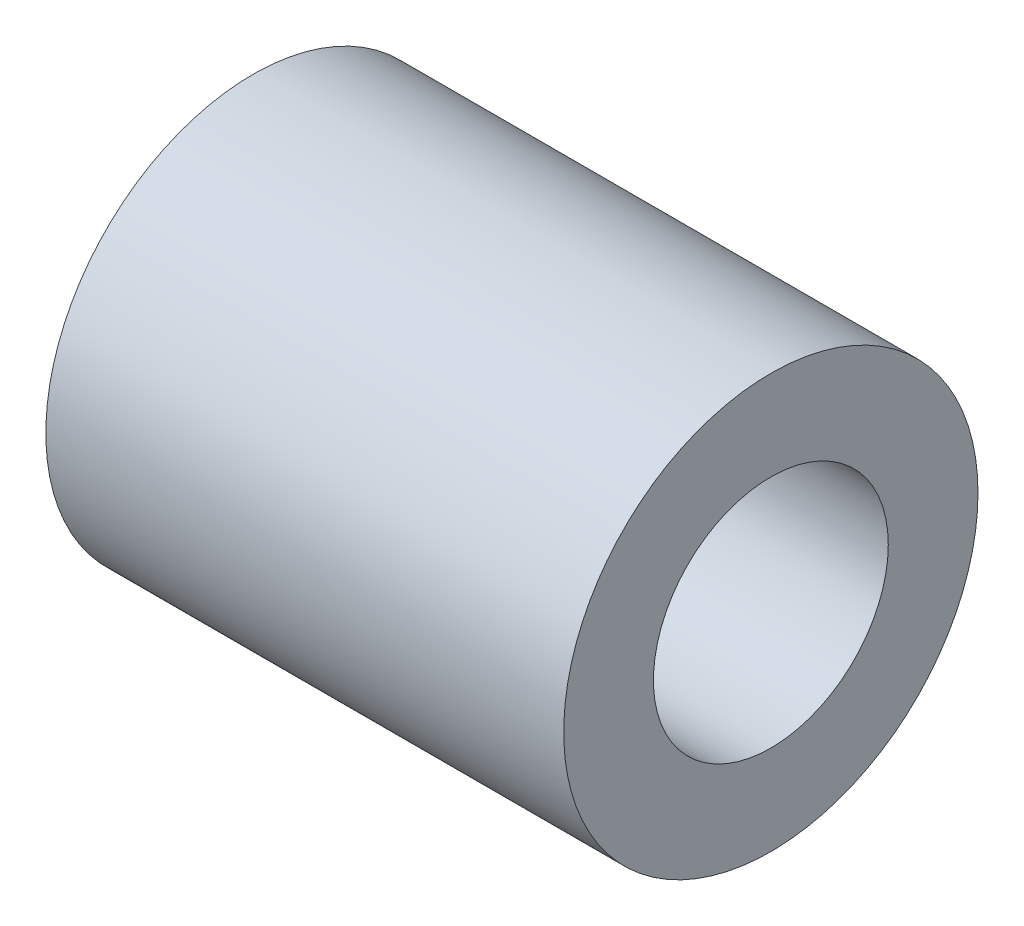
ISO-10303-21;
HEADER;
FILE_DESCRIPTION(('STEP AP214'),'2;1');
FILE_NAME('part.step','',(''),(''),'','','');
FILE_SCHEMA(('AUTOMOTIVE_DESIGN { 1 0 10303 214 1 1 1 1 }'));
ENDSEC;
DATA;
#1=APPLICATION_CONTEXT('core data for automotive mechanical design processes');
#2=APPLICATION_PROTOCOL_DEFINITION('international standard','automotive_design',2000,#1);
#3=PRODUCT_CONTEXT('',#1,'mechanical');
#4=PRODUCT('Part','Part','',(#3));
#5=PRODUCT_RELATED_PRODUCT_CATEGORY('part','',(#4));
#6=PRODUCT_DEFINITION_FORMATION('','',#4);
#7=PRODUCT_DEFINITION_CONTEXT('part definition',#1,'design');
#8=PRODUCT_DEFINITION('design','',#6,#7);
#9=PRODUCT_DEFINITION_SHAPE('','',#8);
#10=(LENGTH_UNIT() NAMED_UNIT(*) SI_UNIT(.MILLI.,.METRE.));
#11=(NAMED_UNIT(*) PLANE_ANGLE_UNIT() SI_UNIT($,.RADIAN.));
#12=(NAMED_UNIT(*) SI_UNIT($,.STERADIAN.) SOLID_ANGLE_UNIT());
#13=UNCERTAINTY_MEASURE_WITH_UNIT(LENGTH_MEASURE(1.E-05),#10,'distance_accuracy_value','');
#14=(GEOMETRIC_REPRESENTATION_CONTEXT(3) GLOBAL_UNCERTAINTY_ASSIGNED_CONTEXT((#13)) GLOBAL_UNIT_ASSIGNED_CONTEXT((#10,
#11,#12)) REPRESENTATION_CONTEXT('',''));
#15=CARTESIAN_POINT('',(0.,0.,0.));
#16=DIRECTION('',(0.,0.,1.));
#17=DIRECTION('',(1.,0.,0.));
#18=AXIS2_PLACEMENT_3D('',#15,#16,#17);
#19=CARTESIAN_POINT('',(7.9375,0.,0.));
#20=DIRECTION('',(1.,0.,0.));
#21=DIRECTION('',(0.,0.,-1.));
#22=AXIS2_PLACEMENT_3D('',#19,#20,#21);
#23=PLANE('',#22);
#24=CARTESIAN_POINT('',(7.9375,0.,0.));
#25=DIRECTION('',(1.,0.,0.));
#26=DIRECTION('',(0.,0.,-1.));
#27=AXIS2_PLACEMENT_3D('',#24,#25,#26);
#28=CIRCLE('',#27,3.175);
#29=CARTESIAN_POINT('',(7.9375,0.,-3.175));
#30=VERTEX_POINT('',#29);
#31=EDGE_CURVE('E10',#30,#30,#28,.T.);
#32=ORIENTED_EDGE('',*,*,#31,.T.);
#33=EDGE_LOOP('',(#32));
#34=FACE_BOUND('',#33,.T.);
#35=CARTESIAN_POINT('',(7.9375,0.,0.));
#36=DIRECTION('',(1.,0.,0.));
#37=DIRECTION('',(0.,0.,-1.));
#38=AXIS2_PLACEMENT_3D('',#35,#36,#37);
#39=CIRCLE('',#38,1.8);
#40=CARTESIAN_POINT('',(7.9375,0.,-1.8));
#41=VERTEX_POINT('',#40);
#42=EDGE_CURVE('E42',#41,#41,#39,.T.);
#43=ORIENTED_EDGE('',*,*,#42,.F.);
#44=EDGE_LOOP('',(#43));
#45=FACE_BOUND('',#44,.T.);
#46=ADVANCED_FACE('F31',(#34,#45),#23,.T.);
#47=CARTESIAN_POINT('',(0.,0.,0.));
#48=DIRECTION('',(1.,0.,0.));
#49=DIRECTION('',(0.,0.,-1.));
#50=AXIS2_PLACEMENT_3D('',#47,#48,#49);
#51=PLANE('',#50);
#52=CARTESIAN_POINT('',(0.,0.,0.));
#53=DIRECTION('',(1.,0.,0.));
#54=DIRECTION('',(0.,0.,-1.));
#55=AXIS2_PLACEMENT_3D('',#52,#53,#54);
#56=CIRCLE('',#55,3.175);
#57=CARTESIAN_POINT('',(0.,0.,-3.175));
#58=VERTEX_POINT('',#57);
#59=EDGE_CURVE('E35',#58,#58,#56,.T.);
#60=ORIENTED_EDGE('',*,*,#59,.F.);
#61=EDGE_LOOP('',(#60));
#62=FACE_BOUND('',#61,.T.);
#63=CARTESIAN_POINT('',(0.,0.,0.));
#64=DIRECTION('',(1.,0.,0.));
#65=DIRECTION('',(0.,0.,-1.));
#66=AXIS2_PLACEMENT_3D('',#63,#64,#65);
#67=CIRCLE('',#66,1.8);
#68=CARTESIAN_POINT('',(0.,0.,-1.8));
#69=VERTEX_POINT('',#68);
#70=EDGE_CURVE('E44',#69,#69,#67,.T.);
#71=ORIENTED_EDGE('',*,*,#70,.T.);
#72=EDGE_LOOP('',(#71));
#73=FACE_BOUND('',#72,.T.);
#74=ADVANCED_FACE('F54',(#62,#73),#51,.F.);
#75=CARTESIAN_POINT('',(7.9375,0.,0.));
#76=DIRECTION('',(-1.,0.,0.));
#77=DIRECTION('',(0.,0.,1.));
#78=AXIS2_PLACEMENT_3D('',#75,#76,#77);
#79=CYLINDRICAL_SURFACE('',#78,3.175);
#80=ORIENTED_EDGE('',*,*,#31,.F.);
#81=EDGE_LOOP('',(#80));
#82=FACE_BOUND('',#81,.T.);
#83=ORIENTED_EDGE('',*,*,#59,.T.);
#84=EDGE_LOOP('',(#83));
#85=FACE_BOUND('',#84,.T.);
#86=ADVANCED_FACE('F33',(#82,#85),#79,.T.);
#87=CARTESIAN_POINT('',(7.9375,0.,0.));
#88=DIRECTION('',(-1.,0.,0.));
#89=DIRECTION('',(0.,0.,1.));
#90=AXIS2_PLACEMENT_3D('',#87,#88,#89);
#91=CYLINDRICAL_SURFACE('',#90,1.8);
#92=ORIENTED_EDGE('',*,*,#42,.T.);
#93=EDGE_LOOP('',(#92));
#94=FACE_BOUND('',#93,.T.);
#95=ORIENTED_EDGE('',*,*,#70,.F.);
#96=EDGE_LOOP('',(#95));
#97=FACE_BOUND('',#96,.T.);
#98=ADVANCED_FACE('F50',(#94,#97),#91,.F.);
#99=CLOSED_SHELL('',(#46,#74,#86,#98));
#100=MANIFOLD_SOLID_BREP('B2',#99);
#101=ADVANCED_BREP_SHAPE_REPRESENTATION('',(#18,#100),#14);
#102=SHAPE_DEFINITION_REPRESENTATION(#9,#101);
ENDSEC;
END-ISO-10303-21;
